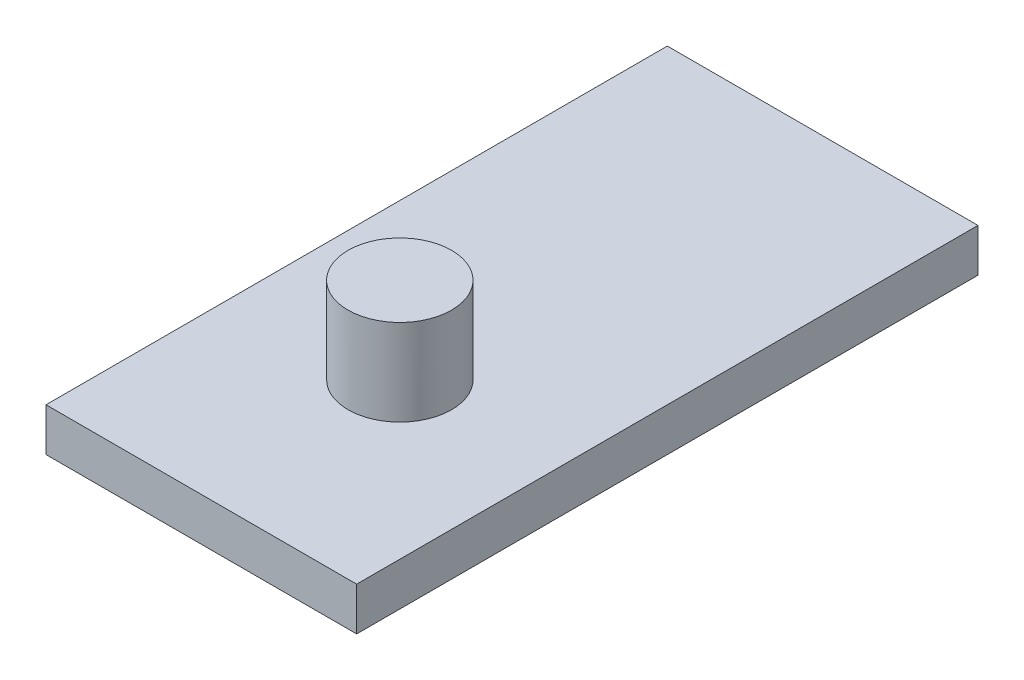
ISO-10303-21;
HEADER;
FILE_DESCRIPTION(('STEP AP214'),'2;1');
FILE_NAME('part.step','',(''),(''),'','','');
FILE_SCHEMA(('AUTOMOTIVE_DESIGN { 1 0 10303 214 1 1 1 1 }'));
ENDSEC;
DATA;
#1=APPLICATION_CONTEXT('core data for automotive mechanical design processes');
#2=APPLICATION_PROTOCOL_DEFINITION('international standard','automotive_design',2000,#1);
#3=PRODUCT_CONTEXT('',#1,'mechanical');
#4=PRODUCT('Part','Part','',(#3));
#5=PRODUCT_RELATED_PRODUCT_CATEGORY('part','',(#4));
#6=PRODUCT_DEFINITION_FORMATION('','',#4);
#7=PRODUCT_DEFINITION_CONTEXT('part definition',#1,'design');
#8=PRODUCT_DEFINITION('design','',#6,#7);
#9=PRODUCT_DEFINITION_SHAPE('','',#8);
#10=(LENGTH_UNIT() NAMED_UNIT(*) SI_UNIT(.MILLI.,.METRE.));
#11=(NAMED_UNIT(*) PLANE_ANGLE_UNIT() SI_UNIT($,.RADIAN.));
#12=(NAMED_UNIT(*) SI_UNIT($,.STERADIAN.) SOLID_ANGLE_UNIT());
#13=UNCERTAINTY_MEASURE_WITH_UNIT(LENGTH_MEASURE(1.E-05),#10,'distance_accuracy_value','');
#14=(GEOMETRIC_REPRESENTATION_CONTEXT(3) GLOBAL_UNCERTAINTY_ASSIGNED_CONTEXT((#13)) GLOBAL_UNIT_ASSIGNED_CONTEXT((#10,
#11,#12)) REPRESENTATION_CONTEXT('',''));
#15=CARTESIAN_POINT('',(0.,0.,0.));
#16=DIRECTION('',(0.,0.,1.));
#17=DIRECTION('',(1.,0.,0.));
#18=AXIS2_PLACEMENT_3D('',#15,#16,#17);
#19=CARTESIAN_POINT('',(18.,5.,36.));
#20=DIRECTION('',(-1.,0.,0.));
#21=DIRECTION('',(0.,0.,1.));
#22=AXIS2_PLACEMENT_3D('',#19,#20,#21);
#23=PLANE('',#22);
#24=DIRECTION('',(0.,0.,-1.));
#25=VECTOR('',#24,1.);
#26=CARTESIAN_POINT('',(18.,0.,36.));
#27=LINE('',#26,#25);
#28=CARTESIAN_POINT('',(18.,0.,36.));
#29=VERTEX_POINT('',#28);
#30=CARTESIAN_POINT('',(18.,0.,-36.));
#31=VERTEX_POINT('',#30);
#32=EDGE_CURVE('E105',#29,#31,#27,.T.);
#33=ORIENTED_EDGE('',*,*,#32,.T.);
#34=DIRECTION('',(0.,-1.,0.));
#35=VECTOR('',#34,1.);
#36=CARTESIAN_POINT('',(18.,5.,-36.));
#37=LINE('',#36,#35);
#38=CARTESIAN_POINT('',(18.,5.,-36.));
#39=VERTEX_POINT('',#38);
#40=EDGE_CURVE('E47',#39,#31,#37,.T.);
#41=ORIENTED_EDGE('',*,*,#40,.F.);
#42=DIRECTION('',(0.,0.,-1.));
#43=VECTOR('',#42,1.);
#44=CARTESIAN_POINT('',(18.,5.,36.));
#45=LINE('',#44,#43);
#46=CARTESIAN_POINT('',(18.,5.,36.));
#47=VERTEX_POINT('',#46);
#48=EDGE_CURVE('E91',#47,#39,#45,.T.);
#49=ORIENTED_EDGE('',*,*,#48,.F.);
#50=DIRECTION('',(0.,-1.,0.));
#51=VECTOR('',#50,1.);
#52=CARTESIAN_POINT('',(18.,5.,36.));
#53=LINE('',#52,#51);
#54=EDGE_CURVE('E101',#47,#29,#53,.T.);
#55=ORIENTED_EDGE('',*,*,#54,.T.);
#56=EDGE_LOOP('',(#33,#41,#49,#55));
#57=FACE_BOUND('',#56,.T.);
#58=ADVANCED_FACE('F39',(#57),#23,.F.);
#59=CARTESIAN_POINT('',(-18.,5.,-36.));
#60=DIRECTION('',(0.,0.,1.));
#61=DIRECTION('',(1.,0.,0.));
#62=AXIS2_PLACEMENT_3D('',#59,#60,#61);
#63=PLANE('',#62);
#64=DIRECTION('',(-1.,0.,0.));
#65=VECTOR('',#64,1.);
#66=CARTESIAN_POINT('',(-18.,0.,-36.));
#67=LINE('',#66,#65);
#68=CARTESIAN_POINT('',(-18.,0.,-36.));
#69=VERTEX_POINT('',#68);
#70=EDGE_CURVE('E96',#31,#69,#67,.T.);
#71=ORIENTED_EDGE('',*,*,#70,.T.);
#72=DIRECTION('',(0.,-1.,0.));
#73=VECTOR('',#72,1.);
#74=CARTESIAN_POINT('',(-18.,5.,-36.));
#75=LINE('',#74,#73);
#76=CARTESIAN_POINT('',(-18.,5.,-36.));
#77=VERTEX_POINT('',#76);
#78=EDGE_CURVE('E94',#77,#69,#75,.T.);
#79=ORIENTED_EDGE('',*,*,#78,.F.);
#80=DIRECTION('',(-1.,0.,0.));
#81=VECTOR('',#80,1.);
#82=CARTESIAN_POINT('',(-18.,5.,-36.));
#83=LINE('',#82,#81);
#84=EDGE_CURVE('E86',#39,#77,#83,.T.);
#85=ORIENTED_EDGE('',*,*,#84,.F.);
#86=ORIENTED_EDGE('',*,*,#40,.T.);
#87=EDGE_LOOP('',(#71,#79,#85,#86));
#88=FACE_BOUND('',#87,.T.);
#89=ADVANCED_FACE('F95',(#88),#63,.F.);
#90=CARTESIAN_POINT('',(-18.,5.,36.));
#91=DIRECTION('',(1.,0.,0.));
#92=DIRECTION('',(0.,0.,-1.));
#93=AXIS2_PLACEMENT_3D('',#90,#91,#92);
#94=PLANE('',#93);
#95=DIRECTION('',(0.,0.,1.));
#96=VECTOR('',#95,1.);
#97=CARTESIAN_POINT('',(-18.,0.,36.));
#98=LINE('',#97,#96);
#99=CARTESIAN_POINT('',(-18.,0.,36.));
#100=VERTEX_POINT('',#99);
#101=EDGE_CURVE('E72',#69,#100,#98,.T.);
#102=ORIENTED_EDGE('',*,*,#101,.T.);
#103=DIRECTION('',(0.,-1.,0.));
#104=VECTOR('',#103,1.);
#105=CARTESIAN_POINT('',(-18.,5.,36.));
#106=LINE('',#105,#104);
#107=CARTESIAN_POINT('',(-18.,5.,36.));
#108=VERTEX_POINT('',#107);
#109=EDGE_CURVE('E97',#108,#100,#106,.T.);
#110=ORIENTED_EDGE('',*,*,#109,.F.);
#111=DIRECTION('',(0.,0.,1.));
#112=VECTOR('',#111,1.);
#113=CARTESIAN_POINT('',(-18.,5.,36.));
#114=LINE('',#113,#112);
#115=EDGE_CURVE('E89',#77,#108,#114,.T.);
#116=ORIENTED_EDGE('',*,*,#115,.F.);
#117=ORIENTED_EDGE('',*,*,#78,.T.);
#118=EDGE_LOOP('',(#102,#110,#116,#117));
#119=FACE_BOUND('',#118,.T.);
#120=ADVANCED_FACE('F99',(#119),#94,.F.);
#121=CARTESIAN_POINT('',(-18.,5.,36.));
#122=DIRECTION('',(0.,0.,-1.));
#123=DIRECTION('',(-1.,0.,0.));
#124=AXIS2_PLACEMENT_3D('',#121,#122,#123);
#125=PLANE('',#124);
#126=DIRECTION('',(1.,0.,0.));
#127=VECTOR('',#126,1.);
#128=CARTESIAN_POINT('',(-18.,0.,36.));
#129=LINE('',#128,#127);
#130=EDGE_CURVE('E78',#100,#29,#129,.T.);
#131=ORIENTED_EDGE('',*,*,#130,.T.);
#132=ORIENTED_EDGE('',*,*,#54,.F.);
#133=DIRECTION('',(1.,0.,0.));
#134=VECTOR('',#133,1.);
#135=CARTESIAN_POINT('',(-18.,5.,36.));
#136=LINE('',#135,#134);
#137=EDGE_CURVE('E55',#108,#47,#136,.T.);
#138=ORIENTED_EDGE('',*,*,#137,.F.);
#139=ORIENTED_EDGE('',*,*,#109,.T.);
#140=EDGE_LOOP('',(#131,#132,#138,#139));
#141=FACE_BOUND('',#140,.T.);
#142=ADVANCED_FACE('F128',(#141),#125,.F.);
#143=CARTESIAN_POINT('',(0.,5.,0.));
#144=DIRECTION('',(0.,-1.,0.));
#145=DIRECTION('',(0.,0.,-1.));
#146=AXIS2_PLACEMENT_3D('',#143,#144,#145);
#147=PLANE('',#146);
#148=CARTESIAN_POINT('',(0.,5.,13.));
#149=DIRECTION('',(0.,-1.,0.));
#150=DIRECTION('',(0.,0.,-1.));
#151=AXIS2_PLACEMENT_3D('',#148,#149,#150);
#152=CIRCLE('',#151,6.);
#153=CARTESIAN_POINT('',(0.,5.,7.));
#154=VERTEX_POINT('',#153);
#155=EDGE_CURVE('E11',#154,#154,#152,.F.);
#156=ORIENTED_EDGE('',*,*,#155,.F.);
#157=EDGE_LOOP('',(#156));
#158=FACE_BOUND('',#157,.T.);
#159=ORIENTED_EDGE('',*,*,#48,.T.);
#160=ORIENTED_EDGE('',*,*,#84,.T.);
#161=ORIENTED_EDGE('',*,*,#115,.T.);
#162=ORIENTED_EDGE('',*,*,#137,.T.);
#163=EDGE_LOOP('',(#159,#160,#161,#162));
#164=FACE_BOUND('',#163,.T.);
#165=ADVANCED_FACE('F87',(#158,#164),#147,.F.);
#166=CARTESIAN_POINT('',(0.,0.,0.));
#167=DIRECTION('',(0.,-1.,0.));
#168=DIRECTION('',(0.,0.,-1.));
#169=AXIS2_PLACEMENT_3D('',#166,#167,#168);
#170=PLANE('',#169);
#171=ORIENTED_EDGE('',*,*,#32,.F.);
#172=ORIENTED_EDGE('',*,*,#130,.F.);
#173=ORIENTED_EDGE('',*,*,#101,.F.);
#174=ORIENTED_EDGE('',*,*,#70,.F.);
#175=EDGE_LOOP('',(#171,#172,#173,#174));
#176=FACE_BOUND('',#175,.T.);
#177=ADVANCED_FACE('F116',(#176),#170,.T.);
#178=CARTESIAN_POINT('',(0.,15.,13.));
#179=DIRECTION('',(0.,-1.,0.));
#180=DIRECTION('',(0.,0.,-1.));
#181=AXIS2_PLACEMENT_3D('',#178,#179,#180);
#182=CYLINDRICAL_SURFACE('',#181,6.);
#183=CARTESIAN_POINT('',(0.,15.,13.));
#184=DIRECTION('',(0.,1.,0.));
#185=DIRECTION('',(0.,0.,1.));
#186=AXIS2_PLACEMENT_3D('',#183,#184,#185);
#187=CIRCLE('',#186,6.);
#188=CARTESIAN_POINT('',(0.,15.,19.));
#189=VERTEX_POINT('',#188);
#190=EDGE_CURVE('E108',#189,#189,#187,.T.);
#191=ORIENTED_EDGE('',*,*,#190,.F.);
#192=EDGE_LOOP('',(#191));
#193=FACE_BOUND('',#192,.T.);
#194=ORIENTED_EDGE('',*,*,#155,.T.);
#195=EDGE_LOOP('',(#194));
#196=FACE_BOUND('',#195,.T.);
#197=ADVANCED_FACE('F118',(#193,#196),#182,.T.);
#198=CARTESIAN_POINT('',(0.,15.,13.));
#199=DIRECTION('',(0.,1.,0.));
#200=DIRECTION('',(0.,0.,1.));
#201=AXIS2_PLACEMENT_3D('',#198,#199,#200);
#202=PLANE('',#201);
#203=ORIENTED_EDGE('',*,*,#190,.T.);
#204=EDGE_LOOP('',(#203));
#205=FACE_BOUND('',#204,.T.);
#206=ADVANCED_FACE('F125',(#205),#202,.T.);
#207=CLOSED_SHELL('',(#58,#89,#120,#142,#165,#177,#197,#206));
#208=MANIFOLD_SOLID_BREP('B2',#207);
#209=ADVANCED_BREP_SHAPE_REPRESENTATION('',(#18,#208),#14);
#210=SHAPE_DEFINITION_REPRESENTATION(#9,#209);
ENDSEC;
END-ISO-10303-21;
